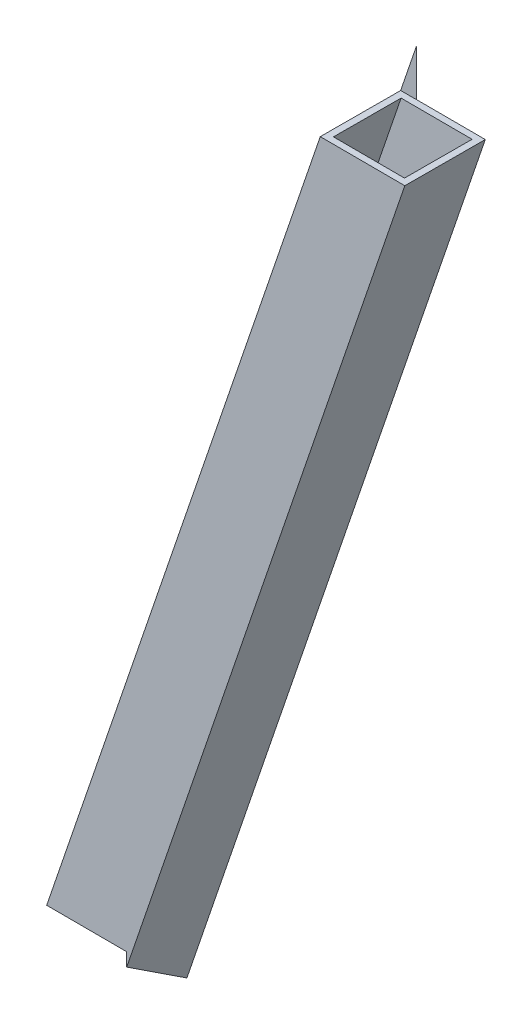
ISO-10303-21;
HEADER;
FILE_DESCRIPTION(('STEP AP214'),'2;1');
FILE_NAME('part.step','',(''),(''),'','','');
FILE_SCHEMA(('AUTOMOTIVE_DESIGN { 1 0 10303 214 1 1 1 1 }'));
ENDSEC;
DATA;
#1=APPLICATION_CONTEXT('core data for automotive mechanical design processes');
#2=APPLICATION_PROTOCOL_DEFINITION('international standard','automotive_design',2000,#1);
#3=PRODUCT_CONTEXT('',#1,'mechanical');
#4=PRODUCT('Part','Part','',(#3));
#5=PRODUCT_RELATED_PRODUCT_CATEGORY('part','',(#4));
#6=PRODUCT_DEFINITION_FORMATION('','',#4);
#7=PRODUCT_DEFINITION_CONTEXT('part definition',#1,'design');
#8=PRODUCT_DEFINITION('design','',#6,#7);
#9=PRODUCT_DEFINITION_SHAPE('','',#8);
#10=(LENGTH_UNIT() NAMED_UNIT(*) SI_UNIT(.MILLI.,.METRE.));
#11=(NAMED_UNIT(*) PLANE_ANGLE_UNIT() SI_UNIT($,.RADIAN.));
#12=(NAMED_UNIT(*) SI_UNIT($,.STERADIAN.) SOLID_ANGLE_UNIT());
#13=UNCERTAINTY_MEASURE_WITH_UNIT(LENGTH_MEASURE(1.E-05),#10,'distance_accuracy_value','');
#14=(GEOMETRIC_REPRESENTATION_CONTEXT(3) GLOBAL_UNCERTAINTY_ASSIGNED_CONTEXT((#13)) GLOBAL_UNIT_ASSIGNED_CONTEXT((#10,
#11,#12)) REPRESENTATION_CONTEXT('',''));
#15=CARTESIAN_POINT('',(0.,0.,0.));
#16=DIRECTION('',(0.,0.,1.));
#17=DIRECTION('',(1.,0.,0.));
#18=AXIS2_PLACEMENT_3D('',#15,#16,#17);
#19=CARTESIAN_POINT('',(259.494014953427,216.76340399315,-2009.96935937523));
#20=DIRECTION('',(-0.946505758584915,0.322672417699403,-0.00305938255490225));
#21=DIRECTION('',(-0.322673927788139,-0.94651018817854,0.));
#22=AXIS2_PLACEMENT_3D('',#19,#20,#21);
#23=PLANE('',#22);
#24=DIRECTION('',(-0.322673927788139,-0.94651018817854,0.));
#25=VECTOR('',#24,1.);
#26=CARTESIAN_POINT('',(259.494014953427,216.76340399315,-2009.96935937523));
#27=LINE('',#26,#25);
#28=CARTESIAN_POINT('',(257.188309046744,210.,-2009.96935937523));
#29=VERTEX_POINT('',#28);
#30=CARTESIAN_POINT('',(182.815424220236,-8.16046215754283,-2009.96935937523));
#31=VERTEX_POINT('',#30);
#32=EDGE_CURVE('E49',#29,#31,#27,.T.);
#33=ORIENTED_EDGE('',*,*,#32,.F.);
#34=DIRECTION('',(0.00323227465391518,0.,-0.999994776186637));
#35=VECTOR('',#34,1.);
#36=CARTESIAN_POINT('',(257.188333135763,210.,-2009.97681201106));
#37=LINE('',#36,#35);
#38=CARTESIAN_POINT('',(257.123663518421,210.,-1989.96945297367));
#39=VERTEX_POINT('',#38);
#40=EDGE_CURVE('E137',#39,#29,#37,.T.);
#41=ORIENTED_EDGE('',*,*,#40,.F.);
#42=DIRECTION('',(-0.322673927788139,-0.94651018817854,0.));
#43=VECTOR('',#42,1.);
#44=CARTESIAN_POINT('',(259.436100218272,216.783147652862,-1989.96945297367));
#45=LINE('',#44,#43);
#46=CARTESIAN_POINT('',(187.815400820627,6.69576275310463,-1989.96945297367));
#47=VERTEX_POINT('',#46);
#48=EDGE_CURVE('E149',#39,#47,#45,.T.);
#49=ORIENTED_EDGE('',*,*,#48,.T.);
#50=DIRECTION('',(0.196766618222741,0.584644563135724,0.787066472890965));
#51=VECTOR('',#50,1.);
#52=CARTESIAN_POINT('',(211.65910876495,77.5415918909721,-1894.59462119638));
#53=LINE('',#52,#51);
#54=EDGE_CURVE('E231',#31,#47,#53,.T.);
#55=ORIENTED_EDGE('',*,*,#54,.F.);
#56=EDGE_LOOP('',(#33,#41,#49,#55));
#57=FACE_BOUND('',#56,.T.);
#58=ADVANCED_FACE('F39',(#57),#23,.F.);
#59=CARTESIAN_POINT('',(259.494014953427,216.76340399315,-2009.96935937523));
#60=DIRECTION('',(-0.00289573675774193,0.000987182985593841,0.999995320078241));
#61=DIRECTION('',(0.99999580734144,0.,0.0028957381687345));
#62=AXIS2_PLACEMENT_3D('',#59,#60,#61);
#63=PLANE('',#62);
#64=DIRECTION('',(0.322673927788139,0.94651018817854,0.));
#65=VECTOR('',#64,1.);
#66=CARTESIAN_POINT('',(-2133.78786446607,-6791.77773576714,-2009.9809611724));
#67=LINE('',#66,#65);
#68=CARTESIAN_POINT('',(182.812523770945,3.58340306143834,-2009.9809611724));
#69=VERTEX_POINT('',#68);
#70=CARTESIAN_POINT('',(185.,10.,-2009.9809611724));
#71=VERTEX_POINT('',#70);
#72=EDGE_CURVE('E11',#69,#71,#67,.T.);
#73=ORIENTED_EDGE('',*,*,#72,.T.);
#74=DIRECTION('',(0.99999580734144,0.,0.0028957381687345));
#75=VECTOR('',#74,1.);
#76=CARTESIAN_POINT('',(259.493423894423,10.,-2009.76524681709));
#77=LINE('',#76,#75);
#78=CARTESIAN_POINT('',(167.876336481568,10.,-2010.03054702633));
#79=VERTEX_POINT('',#78);
#80=EDGE_CURVE('E193',#79,#71,#77,.T.);
#81=ORIENTED_EDGE('',*,*,#80,.F.);
#82=DIRECTION('',(-0.322673927788139,-0.94651018817854,0.));
#83=VECTOR('',#82,1.);
#84=CARTESIAN_POINT('',(240.563899781728,223.216852347138,-2010.03054702633));
#85=LINE('',#84,#83);
#86=CARTESIAN_POINT('',(240.,221.562746320735,-2010.03054702633));
#87=VERTEX_POINT('',#86);
#88=EDGE_CURVE('E170',#87,#79,#85,.T.);
#89=ORIENTED_EDGE('',*,*,#88,.F.);
#90=DIRECTION('',(0.,0.999999512730672,-0.000987187124528356));
#91=VECTOR('',#90,1.);
#92=CARTESIAN_POINT('',(240.,216.763348266662,-2010.02580912006));
#93=LINE('',#92,#91);
#94=CARTESIAN_POINT('',(240.,210.,-2010.01913242648));
#95=VERTEX_POINT('',#94);
#96=EDGE_CURVE('E174',#95,#87,#93,.T.);
#97=ORIENTED_EDGE('',*,*,#96,.F.);
#98=DIRECTION('',(-0.99999580734144,0.,-0.0028957381687345));
#99=VECTOR('',#98,1.);
#100=CARTESIAN_POINT('',(259.493995619392,210.,-2009.96268268263));
#101=LINE('',#100,#99);
#102=EDGE_CURVE('E151',#29,#95,#101,.T.);
#103=ORIENTED_EDGE('',*,*,#102,.F.);
#104=ORIENTED_EDGE('',*,*,#32,.T.);
#105=DIRECTION('',(0.000246975568325472,-0.999999481525949,0.000987902273301889));
#106=VECTOR('',#105,1.);
#107=CARTESIAN_POINT('',(182.759878226524,216.744233030128,-2010.19154335008));
#108=LINE('',#107,#106);
#109=EDGE_CURVE('E225',#69,#31,#108,.T.);
#110=ORIENTED_EDGE('',*,*,#109,.F.);
#111=EDGE_LOOP('',(#73,#81,#89,#97,#103,#104,#110));
#112=FACE_BOUND('',#111,.T.);
#113=ADVANCED_FACE('F250',(#112),#63,.F.);
#114=CARTESIAN_POINT('',(257.974972560878,217.281259354246,-2008.3742618752));
#115=DIRECTION('',(-0.00289573675775995,0.000987182985599982,0.999995320078241));
#116=DIRECTION('',(0.99999580734144,0.,0.00289573816875251));
#117=AXIS2_PLACEMENT_3D('',#114,#115,#116);
#118=PLANE('',#117);
#119=DIRECTION('',(-0.322673927788139,-0.94651018817854,0.));
#120=VECTOR('',#119,1.);
#121=CARTESIAN_POINT('',(257.974972560878,217.281259354246,-2008.3742618752));
#122=LINE('',#121,#120);
#123=CARTESIAN_POINT('',(255.492725053749,210.,-2008.3742618752));
#124=VERTEX_POINT('',#123);
#125=CARTESIAN_POINT('',(183.214198595245,-2.01701094494434,-2008.3742618752));
#126=VERTEX_POINT('',#125);
#127=EDGE_CURVE('E43',#124,#126,#122,.T.);
#128=ORIENTED_EDGE('',*,*,#127,.F.);
#129=DIRECTION('',(-0.99999580734144,0.,-0.00289573816875251));
#130=VECTOR('',#129,1.);
#131=CARTESIAN_POINT('',(257.97495174649,210.,-2008.36707396648));
#132=LINE('',#131,#130);
#133=CARTESIAN_POINT('',(237.74339537179,210.,-2008.42565950212));
#134=VERTEX_POINT('',#133);
#135=EDGE_CURVE('E159',#124,#134,#132,.T.);
#136=ORIENTED_EDGE('',*,*,#135,.T.);
#137=DIRECTION('',(-0.322673927788139,-0.94651018817854,0.));
#138=VECTOR('',#137,1.);
#139=CARTESIAN_POINT('',(242.073675816652,222.702155971596,-2008.42565950212));
#140=LINE('',#139,#138);
#141=CARTESIAN_POINT('',(169.561577189971,10.,-2008.42565950212));
#142=VERTEX_POINT('',#141);
#143=EDGE_CURVE('E156',#134,#142,#140,.T.);
#144=ORIENTED_EDGE('',*,*,#143,.T.);
#145=DIRECTION('',(0.99999580734144,0.,0.00289573816875251));
#146=VECTOR('',#145,1.);
#147=CARTESIAN_POINT('',(257.974380021521,10.,-2008.16963810094));
#148=LINE('',#147,#146);
#149=CARTESIAN_POINT('',(185.,10.,-2008.38095368449));
#150=VERTEX_POINT('',#149);
#151=EDGE_CURVE('E198',#142,#150,#148,.T.);
#152=ORIENTED_EDGE('',*,*,#151,.T.);
#153=DIRECTION('',(0.322673927788139,0.94651018817854,0.));
#154=VECTOR('',#153,1.);
#155=CARTESIAN_POINT('',(-2133.78786446607,-6791.77773576714,-2008.38095368449));
#156=LINE('',#155,#154);
#157=CARTESIAN_POINT('',(183.212525642923,4.75674188590625,-2008.38095368449));
#158=VERTEX_POINT('',#157);
#159=EDGE_CURVE('E222',#158,#150,#156,.T.);
#160=ORIENTED_EDGE('',*,*,#159,.F.);
#161=DIRECTION('',(0.00024697556832701,-0.999999481525949,0.000987902273308038));
#162=VECTOR('',#161,1.);
#163=CARTESIAN_POINT('',(183.160041868564,217.262567878314,-2008.59088878192));
#164=LINE('',#163,#162);
#165=EDGE_CURVE('E226',#158,#126,#164,.T.);
#166=ORIENTED_EDGE('',*,*,#165,.T.);
#167=EDGE_LOOP('',(#128,#136,#144,#152,#160,#166));
#168=FACE_BOUND('',#167,.T.);
#169=ADVANCED_FACE('F41',(#168),#118,.T.);
#170=CARTESIAN_POINT('',(257.974972560878,217.281259354246,-2008.3742618752));
#171=DIRECTION('',(-0.946505758584915,0.322672417699403,-0.0030593825549024));
#172=DIRECTION('',(-0.322673927788139,-0.94651018817854,0.));
#173=AXIS2_PLACEMENT_3D('',#170,#171,#172);
#174=PLANE('',#173);
#175=DIRECTION('',(0.196766618222741,0.584644563135724,0.787066472890965));
#176=VECTOR('',#175,1.);
#177=CARTESIAN_POINT('',(211.336470535358,81.5415394906744,-1895.88517411475));
#178=LINE('',#177,#176);
#179=CARTESIAN_POINT('',(187.258615928232,9.99999999999998,-1992.19659254325));
#180=VERTEX_POINT('',#179);
#181=EDGE_CURVE('E229',#126,#180,#178,.T.);
#182=ORIENTED_EDGE('',*,*,#181,.T.);
#183=DIRECTION('',(-0.00323227465391534,0.,0.999994776186637));
#184=VECTOR('',#183,1.);
#185=CARTESIAN_POINT('',(187.311645141784,10.,-2008.60266635052));
#186=LINE('',#185,#184);
#187=CARTESIAN_POINT('',(187.256604628196,10.,-1991.57434049788));
#188=VERTEX_POINT('',#187);
#189=EDGE_CURVE('E211',#180,#188,#186,.T.);
#190=ORIENTED_EDGE('',*,*,#189,.T.);
#191=DIRECTION('',(-0.322673927788139,-0.94651018817854,0.));
#192=VECTOR('',#191,1.);
#193=CARTESIAN_POINT('',(257.926324183348,217.297844028404,-1991.57434049788));
#194=LINE('',#193,#192);
#195=CARTESIAN_POINT('',(255.438422810031,210.,-1991.57434049788));
#196=VERTEX_POINT('',#195);
#197=EDGE_CURVE('E162',#196,#188,#194,.T.);
#198=ORIENTED_EDGE('',*,*,#197,.F.);
#199=DIRECTION('',(0.00323227465391534,0.,-0.999994776186637));
#200=VECTOR('',#199,1.);
#201=CARTESIAN_POINT('',(255.492750987277,210.,-2008.38228513899));
#202=LINE('',#201,#200);
#203=EDGE_CURVE('E200',#196,#124,#202,.T.);
#204=ORIENTED_EDGE('',*,*,#203,.T.);
#205=ORIENTED_EDGE('',*,*,#127,.T.);
#206=EDGE_LOOP('',(#182,#190,#198,#204,#205));
#207=FACE_BOUND('',#206,.T.);
#208=ADVANCED_FACE('F257',(#207),#174,.T.);
#209=CARTESIAN_POINT('',(184.701425001453,10.,-2002.42535625036));
#210=DIRECTION('',(-0.970142500145332,0.,0.242535625036333));
#211=DIRECTION('',(0.242535625036333,0.,0.970142500145332));
#212=AXIS2_PLACEMENT_3D('',#209,#210,#211);
#213=PLANE('',#212);
#214=ORIENTED_EDGE('',*,*,#54,.T.);
#215=DIRECTION('',(-0.000246975568325472,0.999999481525949,-0.000987902273301888));
#216=VECTOR('',#215,1.);
#217=CARTESIAN_POINT('',(187.763518764888,216.765241249437,-1990.17698119662));
#218=LINE('',#217,#216);
#219=CARTESIAN_POINT('',(187.814584754332,10.,-1989.97271723885));
#220=VERTEX_POINT('',#219);
#221=EDGE_CURVE('E155',#47,#220,#218,.T.);
#222=ORIENTED_EDGE('',*,*,#221,.T.);
#223=DIRECTION('',(0.242535625036333,0.,0.970142500145332));
#224=VECTOR('',#223,1.);
#225=CARTESIAN_POINT('',(184.701425001453,10.,-2002.42535625036));
#226=LINE('',#225,#224);
#227=EDGE_CURVE('E189',#180,#220,#226,.T.);
#228=ORIENTED_EDGE('',*,*,#227,.F.);
#229=ORIENTED_EDGE('',*,*,#181,.F.);
#230=ORIENTED_EDGE('',*,*,#165,.F.);
#231=DIRECTION('',(0.197625199539794,0.57970058531673,0.790500798159178));
#232=VECTOR('',#231,1.);
#233=CARTESIAN_POINT('',(-731.47155432748,-2678.31655936061,-5667.1172735661));
#234=LINE('',#233,#232);
#235=EDGE_CURVE('E180',#69,#158,#234,.T.);
#236=ORIENTED_EDGE('',*,*,#235,.F.);
#237=ORIENTED_EDGE('',*,*,#109,.T.);
#238=EDGE_LOOP('',(#214,#222,#228,#229,#230,#236,#237));
#239=FACE_BOUND('',#238,.T.);
#240=ADVANCED_FACE('F251',(#239),#213,.T.);
#241=CARTESIAN_POINT('',(-2133.78786446607,-6791.77773576714,-2300.));
#242=DIRECTION('',(-0.94651018817854,0.322673927788139,0.));
#243=DIRECTION('',(-0.322673927788139,-0.94651018817854,0.));
#244=AXIS2_PLACEMENT_3D('',#241,#242,#243);
#245=PLANE('',#244);
#246=ORIENTED_EDGE('',*,*,#72,.F.);
#247=ORIENTED_EDGE('',*,*,#235,.T.);
#248=ORIENTED_EDGE('',*,*,#159,.T.);
#249=DIRECTION('',(0.,0.,1.));
#250=VECTOR('',#249,1.);
#251=CARTESIAN_POINT('',(185.,10.,-2300.));
#252=LINE('',#251,#250);
#253=EDGE_CURVE('E195',#71,#150,#252,.T.);
#254=ORIENTED_EDGE('',*,*,#253,.F.);
#255=EDGE_LOOP('',(#246,#247,#248,#254));
#256=FACE_BOUND('',#255,.T.);
#257=ADVANCED_FACE('F238',(#256),#245,.T.);
#258=CARTESIAN_POINT('',(165.,10.,-2300.));
#259=DIRECTION('',(0.,-1.,0.));
#260=DIRECTION('',(0.,0.,-1.));
#261=AXIS2_PLACEMENT_3D('',#258,#259,#260);
#262=PLANE('',#261);
#263=DIRECTION('',(-0.99999580734144,0.,-0.00289573816873449));
#264=VECTOR('',#263,1.);
#265=CARTESIAN_POINT('',(259.435509102829,10.,-1989.76532092499));
#266=LINE('',#265,#264);
#267=CARTESIAN_POINT('',(167.811690953393,10.,-1990.03064062477));
#268=VERTEX_POINT('',#267);
#269=EDGE_CURVE('E187',#220,#268,#266,.T.);
#270=ORIENTED_EDGE('',*,*,#269,.T.);
#271=DIRECTION('',(0.00323227465391656,0.,-0.999994776186637));
#272=VECTOR('',#271,1.);
#273=CARTESIAN_POINT('',(167.877095892113,10.,-2010.26549196753));
#274=LINE('',#273,#272);
#275=EDGE_CURVE('E190',#268,#79,#274,.T.);
#276=ORIENTED_EDGE('',*,*,#275,.T.);
#277=ORIENTED_EDGE('',*,*,#80,.T.);
#278=ORIENTED_EDGE('',*,*,#253,.T.);
#279=ORIENTED_EDGE('',*,*,#151,.F.);
#280=DIRECTION('',(0.00323227465391534,0.,-0.999994776186637));
#281=VECTOR('',#280,1.);
#282=CARTESIAN_POINT('',(169.562334767332,10.,-2008.66003729626));
#283=LINE('',#282,#281);
#284=CARTESIAN_POINT('',(169.507274946293,10.,-1991.6257381248));
#285=VERTEX_POINT('',#284);
#286=EDGE_CURVE('E185',#285,#142,#283,.T.);
#287=ORIENTED_EDGE('',*,*,#286,.F.);
#288=DIRECTION('',(-0.99999580734144,0.,-0.00289573816875251));
#289=VECTOR('',#288,1.);
#290=CARTESIAN_POINT('',(257.925731596581,10.,-1991.36970035158));
#291=LINE('',#290,#289);
#292=EDGE_CURVE('E165',#188,#285,#291,.T.);
#293=ORIENTED_EDGE('',*,*,#292,.F.);
#294=ORIENTED_EDGE('',*,*,#189,.F.);
#295=ORIENTED_EDGE('',*,*,#227,.T.);
#296=EDGE_LOOP('',(#270,#276,#277,#278,#279,#287,#293,#294,#295));
#297=FACE_BOUND('',#296,.T.);
#298=ADVANCED_FACE('F247',(#297),#262,.T.);
#299=CARTESIAN_POINT('',(260.,210.,-2000.));
#300=DIRECTION('',(0.,1.,0.));
#301=DIRECTION('',(0.,0.,1.));
#302=AXIS2_PLACEMENT_3D('',#299,#300,#301);
#303=PLANE('',#302);
#304=DIRECTION('',(0.,0.,-1.));
#305=VECTOR('',#304,1.);
#306=CARTESIAN_POINT('',(240.,210.,-2000.));
#307=LINE('',#306,#305);
#308=CARTESIAN_POINT('',(240.,210.,-2010.));
#309=VERTEX_POINT('',#308);
#310=EDGE_CURVE('E172',#309,#95,#307,.T.);
#311=ORIENTED_EDGE('',*,*,#310,.F.);
#312=DIRECTION('',(1.,0.,0.));
#313=VECTOR('',#312,1.);
#314=CARTESIAN_POINT('',(-250.,210.,-2010.));
#315=LINE('',#314,#313);
#316=CARTESIAN_POINT('',(236.058055926491,210.,-2010.));
#317=VERTEX_POINT('',#316);
#318=EDGE_CURVE('E167',#317,#309,#315,.T.);
#319=ORIENTED_EDGE('',*,*,#318,.F.);
#320=DIRECTION('',(-0.00323227465391656,0.,0.999994776186637));
#321=VECTOR('',#320,1.);
#322=CARTESIAN_POINT('',(236.058201737606,210.,-2010.045110756));
#323=LINE('',#322,#321);
#324=CARTESIAN_POINT('',(235.993509135147,210.,-1990.03064062477));
#325=VERTEX_POINT('',#324);
#326=EDGE_CURVE('E140',#317,#325,#323,.T.);
#327=ORIENTED_EDGE('',*,*,#326,.T.);
#328=DIRECTION('',(0.99999580734144,0.,0.00289573816873449));
#329=VECTOR('',#328,1.);
#330=CARTESIAN_POINT('',(259.436080827797,210.,-1989.96275679053));
#331=LINE('',#330,#329);
#332=EDGE_CURVE('E131',#325,#39,#331,.T.);
#333=ORIENTED_EDGE('',*,*,#332,.T.);
#334=ORIENTED_EDGE('',*,*,#40,.T.);
#335=ORIENTED_EDGE('',*,*,#102,.T.);
#336=EDGE_LOOP('',(#311,#319,#327,#333,#334,#335));
#337=FACE_BOUND('',#336,.T.);
#338=DIRECTION('',(-0.00323227465391534,0.,0.999994776186637));
#339=VECTOR('',#338,1.);
#340=CARTESIAN_POINT('',(237.743440612825,210.,-2008.43965608473));
#341=LINE('',#340,#339);
#342=CARTESIAN_POINT('',(237.689093128069,210.,-1991.6257381248));
#343=VERTEX_POINT('',#342);
#344=EDGE_CURVE('E177',#134,#343,#341,.T.);
#345=ORIENTED_EDGE('',*,*,#344,.F.);
#346=ORIENTED_EDGE('',*,*,#135,.F.);
#347=ORIENTED_EDGE('',*,*,#203,.F.);
#348=DIRECTION('',(0.99999580734144,0.,0.00289573816875251));
#349=VECTOR('',#348,1.);
#350=CARTESIAN_POINT('',(257.92630332155,210.,-1991.56713621712));
#351=LINE('',#350,#349);
#352=EDGE_CURVE('E166',#343,#196,#351,.T.);
#353=ORIENTED_EDGE('',*,*,#352,.F.);
#354=EDGE_LOOP('',(#345,#346,#347,#353));
#355=FACE_BOUND('',#354,.T.);
#356=ADVANCED_FACE('F134',(#337,#355),#303,.T.);
#357=CARTESIAN_POINT('',(242.073675816652,222.702155971596,-2008.42565950212));
#358=DIRECTION('',(0.946505758584915,-0.322672417699403,0.0030593825549024));
#359=DIRECTION('',(0.322673927788139,0.94651018817854,0.));
#360=AXIS2_PLACEMENT_3D('',#357,#358,#359);
#361=PLANE('',#360);
#362=ORIENTED_EDGE('',*,*,#143,.F.);
#363=ORIENTED_EDGE('',*,*,#344,.T.);
#364=DIRECTION('',(-0.322673927788139,-0.94651018817854,0.));
#365=VECTOR('',#364,1.);
#366=CARTESIAN_POINT('',(242.025027439122,222.718740645754,-1991.6257381248));
#367=LINE('',#366,#365);
#368=EDGE_CURVE('E183',#343,#285,#367,.T.);
#369=ORIENTED_EDGE('',*,*,#368,.T.);
#370=ORIENTED_EDGE('',*,*,#286,.T.);
#371=EDGE_LOOP('',(#362,#363,#369,#370));
#372=FACE_BOUND('',#371,.T.);
#373=ADVANCED_FACE('F265',(#372),#361,.T.);
#374=CARTESIAN_POINT('',(-250.,210.,-2010.));
#375=DIRECTION('',(0.,0.,1.));
#376=DIRECTION('',(1.,0.,0.));
#377=AXIS2_PLACEMENT_3D('',#374,#375,#376);
#378=PLANE('',#377);
#379=DIRECTION('',(-0.322673927788139,-0.94651018817854,0.));
#380=VECTOR('',#379,1.);
#381=CARTESIAN_POINT('',(240.563811325167,223.216882502784,-2010.));
#382=LINE('',#381,#380);
#383=CARTESIAN_POINT('',(240.,221.563035948959,-2010.));
#384=VERTEX_POINT('',#383);
#385=EDGE_CURVE('E171',#384,#317,#382,.T.);
#386=ORIENTED_EDGE('',*,*,#385,.T.);
#387=ORIENTED_EDGE('',*,*,#318,.T.);
#388=DIRECTION('',(0.,-1.,0.));
#389=VECTOR('',#388,1.);
#390=CARTESIAN_POINT('',(240.,210.,-2010.));
#391=LINE('',#390,#389);
#392=EDGE_CURVE('E175',#384,#309,#391,.T.);
#393=ORIENTED_EDGE('',*,*,#392,.F.);
#394=EDGE_LOOP('',(#386,#387,#393));
#395=FACE_BOUND('',#394,.T.);
#396=ADVANCED_FACE('F267',(#395),#378,.T.);
#397=CARTESIAN_POINT('',(240.563899781728,223.216852347138,-2010.03054702633));
#398=DIRECTION('',(0.946505758584915,-0.322672417699403,0.00305938255490356));
#399=DIRECTION('',(0.322673927788139,0.94651018817854,0.));
#400=AXIS2_PLACEMENT_3D('',#397,#398,#399);
#401=PLANE('',#400);
#402=ORIENTED_EDGE('',*,*,#385,.F.);
#403=DIRECTION('',(0.,0.00948096236965458,0.999955054666231));
#404=VECTOR('',#403,1.);
#405=CARTESIAN_POINT('',(240.,221.562895006088,-2010.0148652142));
#406=LINE('',#405,#404);
#407=EDGE_CURVE('E201',#87,#384,#406,.T.);
#408=ORIENTED_EDGE('',*,*,#407,.F.);
#409=ORIENTED_EDGE('',*,*,#88,.T.);
#410=ORIENTED_EDGE('',*,*,#275,.F.);
#411=DIRECTION('',(-0.322673927788139,-0.94651018817854,0.));
#412=VECTOR('',#411,1.);
#413=CARTESIAN_POINT('',(240.505985046573,223.23659600685,-1990.03064062477));
#414=LINE('',#413,#412);
#415=EDGE_CURVE('E178',#325,#268,#414,.T.);
#416=ORIENTED_EDGE('',*,*,#415,.F.);
#417=ORIENTED_EDGE('',*,*,#326,.F.);
#418=EDGE_LOOP('',(#402,#408,#409,#410,#416,#417));
#419=FACE_BOUND('',#418,.T.);
#420=ADVANCED_FACE('F274',(#419),#401,.F.);
#421=CARTESIAN_POINT('',(257.926324183348,217.297844028404,-1991.57434049788));
#422=DIRECTION('',(0.00289573675775995,-0.000987182985599982,-0.999995320078241));
#423=DIRECTION('',(-0.99999580734144,0.,-0.00289573816875251));
#424=AXIS2_PLACEMENT_3D('',#421,#422,#423);
#425=PLANE('',#424);
#426=ORIENTED_EDGE('',*,*,#368,.F.);
#427=ORIENTED_EDGE('',*,*,#352,.T.);
#428=ORIENTED_EDGE('',*,*,#197,.T.);
#429=ORIENTED_EDGE('',*,*,#292,.T.);
#430=EDGE_LOOP('',(#426,#427,#428,#429));
#431=FACE_BOUND('',#430,.T.);
#432=ADVANCED_FACE('F260',(#431),#425,.T.);
#433=CARTESIAN_POINT('',(240.,210.,-2000.));
#434=DIRECTION('',(1.,0.,0.));
#435=DIRECTION('',(0.,0.,-1.));
#436=AXIS2_PLACEMENT_3D('',#433,#434,#435);
#437=PLANE('',#436);
#438=ORIENTED_EDGE('',*,*,#407,.T.);
#439=ORIENTED_EDGE('',*,*,#392,.T.);
#440=ORIENTED_EDGE('',*,*,#310,.T.);
#441=ORIENTED_EDGE('',*,*,#96,.T.);
#442=EDGE_LOOP('',(#438,#439,#440,#441));
#443=FACE_BOUND('',#442,.T.);
#444=ADVANCED_FACE('F293',(#443),#437,.T.);
#445=CARTESIAN_POINT('',(259.436100218272,216.783147652862,-1989.96945297367));
#446=DIRECTION('',(0.00289573675774193,-0.00098718298559384,-0.999995320078241));
#447=DIRECTION('',(-0.99999580734144,0.,-0.00289573816873449));
#448=AXIS2_PLACEMENT_3D('',#445,#446,#447);
#449=PLANE('',#448);
#450=ORIENTED_EDGE('',*,*,#48,.F.);
#451=ORIENTED_EDGE('',*,*,#332,.F.);
#452=ORIENTED_EDGE('',*,*,#415,.T.);
#453=ORIENTED_EDGE('',*,*,#269,.F.);
#454=ORIENTED_EDGE('',*,*,#221,.F.);
#455=EDGE_LOOP('',(#450,#451,#452,#453,#454));
#456=FACE_BOUND('',#455,.T.);
#457=ADVANCED_FACE('F153',(#456),#449,.F.);
#458=CLOSED_SHELL('',(#58,#113,#169,#208,#240,#257,#298,#356,#373,#396,#420,#432,#444,#457));
#459=MANIFOLD_SOLID_BREP('B2',#458);
#460=ADVANCED_BREP_SHAPE_REPRESENTATION('',(#18,#459),#14);
#461=SHAPE_DEFINITION_REPRESENTATION(#9,#460);
ENDSEC;
END-ISO-10303-21;
